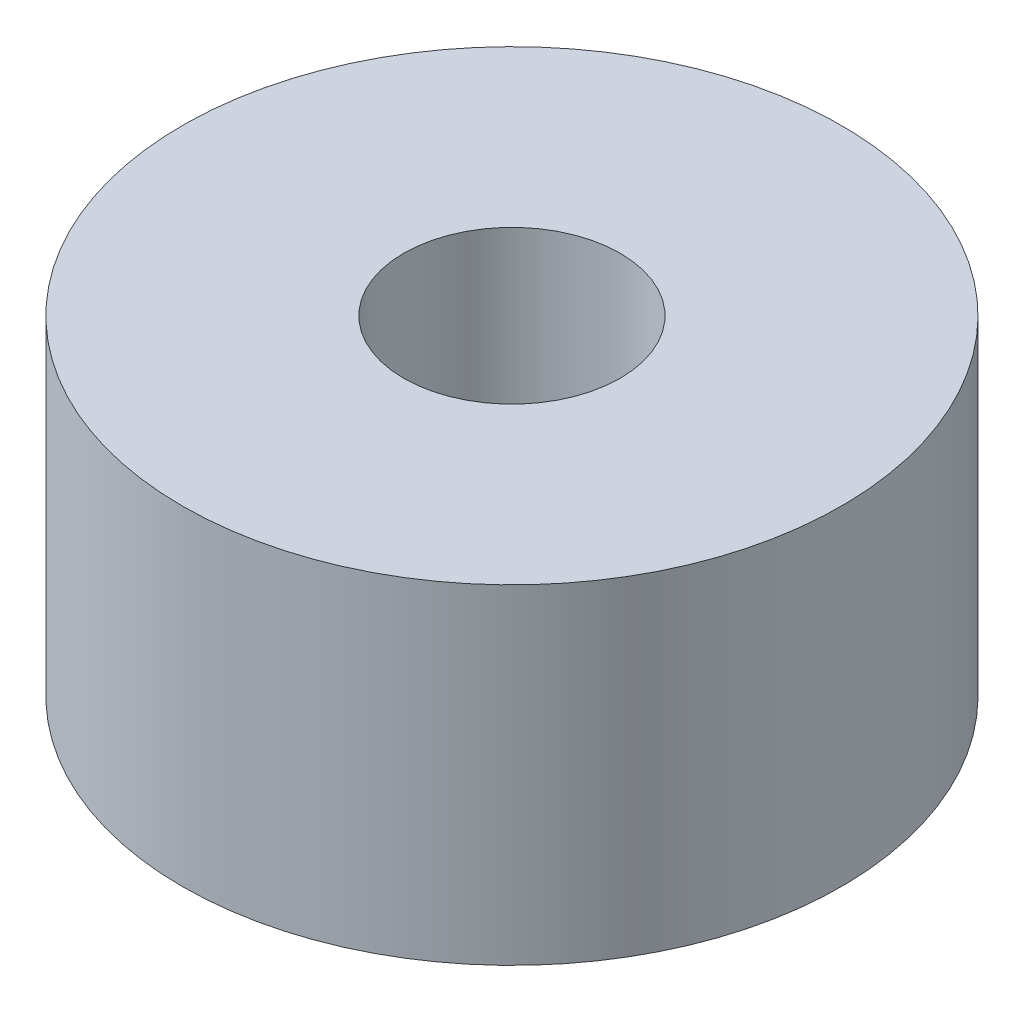
ISO-10303-21;
HEADER;
FILE_DESCRIPTION(('STEP AP214'),'2;1');
FILE_NAME('part.step','',(''),(''),'','','');
FILE_SCHEMA(('AUTOMOTIVE_DESIGN { 1 0 10303 214 1 1 1 1 }'));
ENDSEC;
DATA;
#1=APPLICATION_CONTEXT('core data for automotive mechanical design processes');
#2=APPLICATION_PROTOCOL_DEFINITION('international standard','automotive_design',2000,#1);
#3=PRODUCT_CONTEXT('',#1,'mechanical');
#4=PRODUCT('Part','Part','',(#3));
#5=PRODUCT_RELATED_PRODUCT_CATEGORY('part','',(#4));
#6=PRODUCT_DEFINITION_FORMATION('','',#4);
#7=PRODUCT_DEFINITION_CONTEXT('part definition',#1,'design');
#8=PRODUCT_DEFINITION('design','',#6,#7);
#9=PRODUCT_DEFINITION_SHAPE('','',#8);
#10=(LENGTH_UNIT() NAMED_UNIT(*) SI_UNIT(.MILLI.,.METRE.));
#11=(NAMED_UNIT(*) PLANE_ANGLE_UNIT() SI_UNIT($,.RADIAN.));
#12=(NAMED_UNIT(*) SI_UNIT($,.STERADIAN.) SOLID_ANGLE_UNIT());
#13=UNCERTAINTY_MEASURE_WITH_UNIT(LENGTH_MEASURE(1.E-05),#10,'distance_accuracy_value','');
#14=(GEOMETRIC_REPRESENTATION_CONTEXT(3) GLOBAL_UNCERTAINTY_ASSIGNED_CONTEXT((#13)) GLOBAL_UNIT_ASSIGNED_CONTEXT((#10,
#11,#12)) REPRESENTATION_CONTEXT('',''));
#15=CARTESIAN_POINT('',(0.,0.,0.));
#16=DIRECTION('',(0.,0.,1.));
#17=DIRECTION('',(1.,0.,0.));
#18=AXIS2_PLACEMENT_3D('',#15,#16,#17);
#19=CARTESIAN_POINT('',(0.,-350.,0.));
#20=DIRECTION('',(0.,1.,0.));
#21=DIRECTION('',(0.,0.,1.));
#22=AXIS2_PLACEMENT_3D('',#19,#20,#21);
#23=CYLINDRICAL_SURFACE('',#22,350.);
#24=CARTESIAN_POINT('',(0.,-350.,0.));
#25=DIRECTION('',(0.,1.,0.));
#26=DIRECTION('',(0.,0.,1.));
#27=AXIS2_PLACEMENT_3D('',#24,#25,#26);
#28=CIRCLE('',#27,350.);
#29=CARTESIAN_POINT('',(0.,-350.,350.));
#30=VERTEX_POINT('',#29);
#31=EDGE_CURVE('E11',#30,#30,#28,.T.);
#32=ORIENTED_EDGE('',*,*,#31,.T.);
#33=EDGE_LOOP('',(#32));
#34=FACE_BOUND('',#33,.T.);
#35=CARTESIAN_POINT('',(0.,0.,0.));
#36=DIRECTION('',(0.,1.,0.));
#37=DIRECTION('',(0.,0.,1.));
#38=AXIS2_PLACEMENT_3D('',#35,#36,#37);
#39=CIRCLE('',#38,350.);
#40=CARTESIAN_POINT('',(0.,0.,350.));
#41=VERTEX_POINT('',#40);
#42=EDGE_CURVE('E49',#41,#41,#39,.T.);
#43=ORIENTED_EDGE('',*,*,#42,.F.);
#44=EDGE_LOOP('',(#43));
#45=FACE_BOUND('',#44,.T.);
#46=ADVANCED_FACE('F46',(#34,#45),#23,.T.);
#47=CARTESIAN_POINT('',(0.,-350.,0.));
#48=DIRECTION('',(0.,1.,0.));
#49=DIRECTION('',(0.,0.,1.));
#50=AXIS2_PLACEMENT_3D('',#47,#48,#49);
#51=PLANE('',#50);
#52=CARTESIAN_POINT('',(0.,-350.,0.));
#53=DIRECTION('',(0.,1.,0.));
#54=DIRECTION('',(0.,0.,1.));
#55=AXIS2_PLACEMENT_3D('',#52,#53,#54);
#56=CIRCLE('',#55,115.);
#57=CARTESIAN_POINT('',(0.,-350.,115.));
#58=VERTEX_POINT('',#57);
#59=EDGE_CURVE('E56',#58,#58,#56,.T.);
#60=ORIENTED_EDGE('',*,*,#59,.T.);
#61=EDGE_LOOP('',(#60));
#62=FACE_BOUND('',#61,.T.);
#63=ORIENTED_EDGE('',*,*,#31,.F.);
#64=EDGE_LOOP('',(#63));
#65=FACE_BOUND('',#64,.T.);
#66=ADVANCED_FACE('F64',(#62,#65),#51,.F.);
#67=CARTESIAN_POINT('',(0.,0.,0.));
#68=DIRECTION('',(0.,1.,0.));
#69=DIRECTION('',(0.,0.,1.));
#70=AXIS2_PLACEMENT_3D('',#67,#68,#69);
#71=PLANE('',#70);
#72=CARTESIAN_POINT('',(0.,0.,0.));
#73=DIRECTION('',(0.,1.,0.));
#74=DIRECTION('',(0.,0.,1.));
#75=AXIS2_PLACEMENT_3D('',#72,#73,#74);
#76=CIRCLE('',#75,115.);
#77=CARTESIAN_POINT('',(0.,0.,115.));
#78=VERTEX_POINT('',#77);
#79=EDGE_CURVE('E58',#78,#78,#76,.T.);
#80=ORIENTED_EDGE('',*,*,#79,.F.);
#81=EDGE_LOOP('',(#80));
#82=FACE_BOUND('',#81,.T.);
#83=ORIENTED_EDGE('',*,*,#42,.T.);
#84=EDGE_LOOP('',(#83));
#85=FACE_BOUND('',#84,.T.);
#86=ADVANCED_FACE('F70',(#82,#85),#71,.T.);
#87=CARTESIAN_POINT('',(0.,-350.,0.));
#88=DIRECTION('',(0.,1.,0.));
#89=DIRECTION('',(0.,0.,1.));
#90=AXIS2_PLACEMENT_3D('',#87,#88,#89);
#91=CYLINDRICAL_SURFACE('',#90,115.);
#92=ORIENTED_EDGE('',*,*,#59,.F.);
#93=EDGE_LOOP('',(#92));
#94=FACE_BOUND('',#93,.T.);
#95=ORIENTED_EDGE('',*,*,#79,.T.);
#96=EDGE_LOOP('',(#95));
#97=FACE_BOUND('',#96,.T.);
#98=ADVANCED_FACE('F67',(#94,#97),#91,.F.);
#99=CLOSED_SHELL('',(#46,#66,#86,#98));
#100=MANIFOLD_SOLID_BREP('B2',#99);
#101=ADVANCED_BREP_SHAPE_REPRESENTATION('',(#18,#100),#14);
#102=SHAPE_DEFINITION_REPRESENTATION(#9,#101);
ENDSEC;
END-ISO-10303-21;
